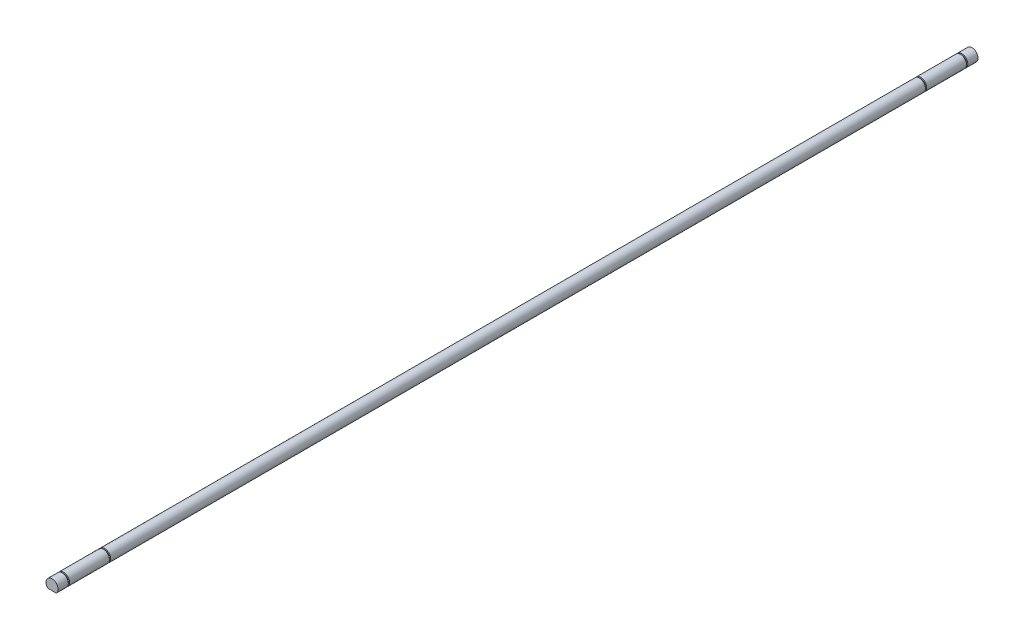
ISO-10303-21;
HEADER;
FILE_DESCRIPTION(('STEP AP214'),'2;1');
FILE_NAME('part.step','',(''),(''),'','','');
FILE_SCHEMA(('AUTOMOTIVE_DESIGN { 1 0 10303 214 1 1 1 1 }'));
ENDSEC;
DATA;
#1=APPLICATION_CONTEXT('core data for automotive mechanical design processes');
#2=APPLICATION_PROTOCOL_DEFINITION('international standard','automotive_design',2000,#1);
#3=PRODUCT_CONTEXT('',#1,'mechanical');
#4=PRODUCT('Part','Part','',(#3));
#5=PRODUCT_RELATED_PRODUCT_CATEGORY('part','',(#4));
#6=PRODUCT_DEFINITION_FORMATION('','',#4);
#7=PRODUCT_DEFINITION_CONTEXT('part definition',#1,'design');
#8=PRODUCT_DEFINITION('design','',#6,#7);
#9=PRODUCT_DEFINITION_SHAPE('','',#8);
#10=(LENGTH_UNIT() NAMED_UNIT(*) SI_UNIT(.MILLI.,.METRE.));
#11=(NAMED_UNIT(*) PLANE_ANGLE_UNIT() SI_UNIT($,.RADIAN.));
#12=(NAMED_UNIT(*) SI_UNIT($,.STERADIAN.) SOLID_ANGLE_UNIT());
#13=UNCERTAINTY_MEASURE_WITH_UNIT(LENGTH_MEASURE(1.E-05),#10,'distance_accuracy_value','');
#14=(GEOMETRIC_REPRESENTATION_CONTEXT(3) GLOBAL_UNCERTAINTY_ASSIGNED_CONTEXT((#13)) GLOBAL_UNIT_ASSIGNED_CONTEXT((#10,
#11,#12)) REPRESENTATION_CONTEXT('',''));
#15=CARTESIAN_POINT('',(0.,0.,0.));
#16=DIRECTION('',(0.,0.,1.));
#17=DIRECTION('',(1.,0.,0.));
#18=AXIS2_PLACEMENT_3D('',#15,#16,#17);
#19=CARTESIAN_POINT('',(482.6,57.15,-330.2));
#20=DIRECTION('',(0.,0.,1.));
#21=DIRECTION('',(1.,0.,0.));
#22=AXIS2_PLACEMENT_3D('',#19,#20,#21);
#23=CYLINDRICAL_SURFACE('',#22,2.36499999999997);
#24=DIRECTION('',(0.,0.,1.));
#25=VECTOR('',#24,1.);
#26=CARTESIAN_POINT('',(483.645574005032,55.0286796564403,-330.2));
#27=LINE('',#26,#25);
#28=CARTESIAN_POINT('',(483.645574005032,55.0286796564403,-325.12));
#29=VERTEX_POINT('',#28);
#30=CARTESIAN_POINT('',(483.645574005032,55.0286796564403,-324.485));
#31=VERTEX_POINT('',#30);
#32=EDGE_CURVE('E277',#29,#31,#27,.T.);
#33=ORIENTED_EDGE('',*,*,#32,.F.);
#34=CARTESIAN_POINT('',(482.6,57.15,-325.12));
#35=DIRECTION('',(0.,0.,1.));
#36=DIRECTION('',(1.,0.,0.));
#37=AXIS2_PLACEMENT_3D('',#34,#35,#36);
#38=CIRCLE('',#37,2.36499999999997);
#39=CARTESIAN_POINT('',(481.554425994967,55.0286796564404,-325.12));
#40=VERTEX_POINT('',#39);
#41=EDGE_CURVE('E251',#29,#40,#38,.T.);
#42=ORIENTED_EDGE('',*,*,#41,.T.);
#43=DIRECTION('',(0.,0.,1.));
#44=VECTOR('',#43,1.);
#45=CARTESIAN_POINT('',(481.554425994967,55.0286796564404,-330.2));
#46=LINE('',#45,#44);
#47=CARTESIAN_POINT('',(481.554425994967,55.0286796564404,-324.485));
#48=VERTEX_POINT('',#47);
#49=EDGE_CURVE('E280',#40,#48,#46,.T.);
#50=ORIENTED_EDGE('',*,*,#49,.T.);
#51=CARTESIAN_POINT('',(482.6,57.15,-324.485));
#52=DIRECTION('',(0.,0.,1.));
#53=DIRECTION('',(1.,0.,0.));
#54=AXIS2_PLACEMENT_3D('',#51,#52,#53);
#55=CIRCLE('',#54,2.36499999999997);
#56=EDGE_CURVE('E11',#31,#48,#55,.T.);
#57=ORIENTED_EDGE('',*,*,#56,.F.);
#58=EDGE_LOOP('',(#33,#42,#50,#57));
#59=FACE_BOUND('',#58,.T.);
#60=ADVANCED_FACE('F49',(#59),#23,.T.);
#61=CARTESIAN_POINT('',(4.50000598645352E-13,55.0286796564443,-101.6));
#62=DIRECTION('',(0.,1.,0.));
#63=DIRECTION('',(-1.,0.,0.));
#64=AXIS2_PLACEMENT_3D('',#61,#62,#63);
#65=PLANE('',#64);
#66=ORIENTED_EDGE('',*,*,#49,.F.);
#67=DIRECTION('',(1.,0.,0.));
#68=VECTOR('',#67,1.);
#69=CARTESIAN_POINT('',(4.50000598645352E-13,55.0286796564443,-325.12));
#70=LINE('',#69,#68);
#71=CARTESIAN_POINT('',(480.47867965644,55.0286796564404,-325.12));
#72=VERTEX_POINT('',#71);
#73=EDGE_CURVE('E64',#72,#40,#70,.T.);
#74=ORIENTED_EDGE('',*,*,#73,.F.);
#75=DIRECTION('',(0.,0.,1.));
#76=VECTOR('',#75,1.);
#77=CARTESIAN_POINT('',(480.47867965644,55.0286796564404,-330.2));
#78=LINE('',#77,#76);
#79=CARTESIAN_POINT('',(480.47867965644,55.0286796564404,-330.2));
#80=VERTEX_POINT('',#79);
#81=EDGE_CURVE('E249',#80,#72,#78,.T.);
#82=ORIENTED_EDGE('',*,*,#81,.F.);
#83=DIRECTION('',(-1.,0.,0.));
#84=VECTOR('',#83,1.);
#85=CARTESIAN_POINT('',(4.50000598645352E-13,55.0286796564443,-330.2));
#86=LINE('',#85,#84);
#87=CARTESIAN_POINT('',(484.72132034356,55.0286796564403,-330.2));
#88=VERTEX_POINT('',#87);
#89=EDGE_CURVE('E272',#88,#80,#86,.T.);
#90=ORIENTED_EDGE('',*,*,#89,.F.);
#91=DIRECTION('',(0.,0.,1.));
#92=VECTOR('',#91,1.);
#93=CARTESIAN_POINT('',(484.72132034356,55.0286796564403,-330.2));
#94=LINE('',#93,#92);
#95=CARTESIAN_POINT('',(484.72132034356,55.0286796564403,-325.12));
#96=VERTEX_POINT('',#95);
#97=EDGE_CURVE('E245',#88,#96,#94,.T.);
#98=ORIENTED_EDGE('',*,*,#97,.T.);
#99=EDGE_CURVE('E241',#29,#96,#70,.T.);
#100=ORIENTED_EDGE('',*,*,#99,.F.);
#101=ORIENTED_EDGE('',*,*,#32,.T.);
#102=DIRECTION('',(1.,0.,0.));
#103=VECTOR('',#102,1.);
#104=CARTESIAN_POINT('',(4.50000598645352E-13,55.0286796564443,-324.485));
#105=LINE('',#104,#103);
#106=CARTESIAN_POINT('',(484.72132034356,55.0286796564403,-324.485));
#107=VERTEX_POINT('',#106);
#108=EDGE_CURVE('E260',#31,#107,#105,.T.);
#109=ORIENTED_EDGE('',*,*,#108,.T.);
#110=DIRECTION('',(0.,0.,1.));
#111=VECTOR('',#110,1.);
#112=CARTESIAN_POINT('',(484.72132034356,55.0286796564403,-324.485));
#113=LINE('',#112,#111);
#114=CARTESIAN_POINT('',(484.72132034356,55.0286796564403,-304.699971157455));
#115=VERTEX_POINT('',#114);
#116=EDGE_CURVE('E263',#107,#115,#113,.T.);
#117=ORIENTED_EDGE('',*,*,#116,.T.);
#118=DIRECTION('',(1.,0.,0.));
#119=VECTOR('',#118,1.);
#120=CARTESIAN_POINT('',(4.50000598645352E-13,55.0286796564443,-304.699971157455));
#121=LINE('',#120,#119);
#122=CARTESIAN_POINT('',(483.645574005032,55.0286796564403,-304.699971157455));
#123=VERTEX_POINT('',#122);
#124=EDGE_CURVE('E255',#123,#115,#121,.T.);
#125=ORIENTED_EDGE('',*,*,#124,.F.);
#126=CARTESIAN_POINT('',(483.645574005032,55.0286796564403,-304.064971157455));
#127=VERTEX_POINT('',#126);
#128=EDGE_CURVE('E274',#123,#127,#27,.T.);
#129=ORIENTED_EDGE('',*,*,#128,.T.);
#130=DIRECTION('',(1.,0.,0.));
#131=VECTOR('',#130,1.);
#132=CARTESIAN_POINT('',(4.50000598645352E-13,55.0286796564443,-304.064971157455));
#133=LINE('',#132,#131);
#134=CARTESIAN_POINT('',(484.72132034356,55.0286796564403,-304.064971157455));
#135=VERTEX_POINT('',#134);
#136=EDGE_CURVE('E282',#127,#135,#133,.T.);
#137=ORIENTED_EDGE('',*,*,#136,.T.);
#138=DIRECTION('',(0.,0.,-1.));
#139=VECTOR('',#138,1.);
#140=CARTESIAN_POINT('',(484.72132034356,55.0286796564403,-101.6));
#141=LINE('',#140,#139);
#142=CARTESIAN_POINT('',(484.72132034356,55.0286796564403,100.864971157455));
#143=VERTEX_POINT('',#142);
#144=EDGE_CURVE('E291',#143,#135,#141,.T.);
#145=ORIENTED_EDGE('',*,*,#144,.F.);
#146=DIRECTION('',(1.,0.,0.));
#147=VECTOR('',#146,1.);
#148=CARTESIAN_POINT('',(4.50000598645352E-13,55.0286796564443,100.864971157455));
#149=LINE('',#148,#147);
#150=CARTESIAN_POINT('',(483.645574005032,55.0286796564403,100.864971157455));
#151=VERTEX_POINT('',#150);
#152=EDGE_CURVE('E229',#151,#143,#149,.T.);
#153=ORIENTED_EDGE('',*,*,#152,.F.);
#154=DIRECTION('',(0.,0.,-1.));
#155=VECTOR('',#154,1.);
#156=CARTESIAN_POINT('',(483.645574005032,55.0286796564403,127.));
#157=LINE('',#156,#155);
#158=CARTESIAN_POINT('',(483.645574005032,55.0286796564403,101.499971157456));
#159=VERTEX_POINT('',#158);
#160=EDGE_CURVE('E191',#159,#151,#157,.T.);
#161=ORIENTED_EDGE('',*,*,#160,.F.);
#162=DIRECTION('',(1.,0.,0.));
#163=VECTOR('',#162,1.);
#164=CARTESIAN_POINT('',(4.50000598645352E-13,55.0286796564443,101.499971157456));
#165=LINE('',#164,#163);
#166=CARTESIAN_POINT('',(484.72132034356,55.0286796564403,101.499971157456));
#167=VERTEX_POINT('',#166);
#168=EDGE_CURVE('E204',#159,#167,#165,.T.);
#169=ORIENTED_EDGE('',*,*,#168,.T.);
#170=DIRECTION('',(0.,0.,-1.));
#171=VECTOR('',#170,1.);
#172=CARTESIAN_POINT('',(484.72132034356,55.0286796564403,121.285));
#173=LINE('',#172,#171);
#174=CARTESIAN_POINT('',(484.72132034356,55.0286796564403,121.285));
#175=VERTEX_POINT('',#174);
#176=EDGE_CURVE('E210',#175,#167,#173,.T.);
#177=ORIENTED_EDGE('',*,*,#176,.F.);
#178=DIRECTION('',(1.,0.,0.));
#179=VECTOR('',#178,1.);
#180=CARTESIAN_POINT('',(4.50000598645352E-13,55.0286796564443,121.285));
#181=LINE('',#180,#179);
#182=CARTESIAN_POINT('',(483.645574005032,55.0286796564403,121.285));
#183=VERTEX_POINT('',#182);
#184=EDGE_CURVE('E208',#183,#175,#181,.T.);
#185=ORIENTED_EDGE('',*,*,#184,.F.);
#186=CARTESIAN_POINT('',(483.645574005032,55.0286796564403,121.92));
#187=VERTEX_POINT('',#186);
#188=EDGE_CURVE('E222',#187,#183,#157,.T.);
#189=ORIENTED_EDGE('',*,*,#188,.F.);
#190=DIRECTION('',(1.,0.,0.));
#191=VECTOR('',#190,1.);
#192=CARTESIAN_POINT('',(4.50000598645352E-13,55.0286796564443,121.92));
#193=LINE('',#192,#191);
#194=CARTESIAN_POINT('',(484.72132034356,55.0286796564403,121.92));
#195=VERTEX_POINT('',#194);
#196=EDGE_CURVE('E196',#187,#195,#193,.T.);
#197=ORIENTED_EDGE('',*,*,#196,.T.);
#198=DIRECTION('',(0.,0.,-1.));
#199=VECTOR('',#198,1.);
#200=CARTESIAN_POINT('',(484.72132034356,55.0286796564403,127.));
#201=LINE('',#200,#199);
#202=CARTESIAN_POINT('',(484.72132034356,55.0286796564403,127.));
#203=VERTEX_POINT('',#202);
#204=EDGE_CURVE('E180',#203,#195,#201,.T.);
#205=ORIENTED_EDGE('',*,*,#204,.F.);
#206=DIRECTION('',(-1.,0.,0.));
#207=VECTOR('',#206,1.);
#208=CARTESIAN_POINT('',(4.50000598645352E-13,55.0286796564443,127.));
#209=LINE('',#208,#207);
#210=CARTESIAN_POINT('',(480.47867965644,55.0286796564404,127.));
#211=VERTEX_POINT('',#210);
#212=EDGE_CURVE('E188',#203,#211,#209,.T.);
#213=ORIENTED_EDGE('',*,*,#212,.T.);
#214=DIRECTION('',(0.,0.,-1.));
#215=VECTOR('',#214,1.);
#216=CARTESIAN_POINT('',(480.47867965644,55.0286796564404,127.));
#217=LINE('',#216,#215);
#218=CARTESIAN_POINT('',(480.47867965644,55.0286796564404,121.92));
#219=VERTEX_POINT('',#218);
#220=EDGE_CURVE('E183',#211,#219,#217,.T.);
#221=ORIENTED_EDGE('',*,*,#220,.T.);
#222=CARTESIAN_POINT('',(481.554425994967,55.0286796564404,121.92));
#223=VERTEX_POINT('',#222);
#224=EDGE_CURVE('E380',#219,#223,#193,.T.);
#225=ORIENTED_EDGE('',*,*,#224,.T.);
#226=DIRECTION('',(0.,0.,-1.));
#227=VECTOR('',#226,1.);
#228=CARTESIAN_POINT('',(481.554425994967,55.0286796564404,127.));
#229=LINE('',#228,#227);
#230=CARTESIAN_POINT('',(481.554425994967,55.0286796564404,121.285));
#231=VERTEX_POINT('',#230);
#232=EDGE_CURVE('E226',#223,#231,#229,.T.);
#233=ORIENTED_EDGE('',*,*,#232,.T.);
#234=CARTESIAN_POINT('',(480.47867965644,55.0286796564404,121.285));
#235=VERTEX_POINT('',#234);
#236=EDGE_CURVE('E205',#235,#231,#181,.T.);
#237=ORIENTED_EDGE('',*,*,#236,.F.);
#238=DIRECTION('',(0.,0.,-1.));
#239=VECTOR('',#238,1.);
#240=CARTESIAN_POINT('',(480.47867965644,55.0286796564404,121.285));
#241=LINE('',#240,#239);
#242=CARTESIAN_POINT('',(480.47867965644,55.0286796564404,101.499971157456));
#243=VERTEX_POINT('',#242);
#244=EDGE_CURVE('E216',#235,#243,#241,.T.);
#245=ORIENTED_EDGE('',*,*,#244,.T.);
#246=CARTESIAN_POINT('',(481.554425994967,55.0286796564404,101.499971157456));
#247=VERTEX_POINT('',#246);
#248=EDGE_CURVE('E211',#243,#247,#165,.T.);
#249=ORIENTED_EDGE('',*,*,#248,.T.);
#250=CARTESIAN_POINT('',(481.554425994967,55.0286796564404,100.864971157455));
#251=VERTEX_POINT('',#250);
#252=EDGE_CURVE('E225',#247,#251,#229,.T.);
#253=ORIENTED_EDGE('',*,*,#252,.T.);
#254=CARTESIAN_POINT('',(480.47867965644,55.0286796564404,100.864971157455));
#255=VERTEX_POINT('',#254);
#256=EDGE_CURVE('E230',#255,#251,#149,.T.);
#257=ORIENTED_EDGE('',*,*,#256,.F.);
#258=DIRECTION('',(0.,0.,-1.));
#259=VECTOR('',#258,1.);
#260=CARTESIAN_POINT('',(480.47867965644,55.0286796564404,-101.6));
#261=LINE('',#260,#259);
#262=CARTESIAN_POINT('',(480.47867965644,55.0286796564404,-304.064971157455));
#263=VERTEX_POINT('',#262);
#264=EDGE_CURVE('E288',#255,#263,#261,.T.);
#265=ORIENTED_EDGE('',*,*,#264,.T.);
#266=CARTESIAN_POINT('',(481.554425994967,55.0286796564404,-304.064971157455));
#267=VERTEX_POINT('',#266);
#268=EDGE_CURVE('E283',#263,#267,#133,.T.);
#269=ORIENTED_EDGE('',*,*,#268,.T.);
#270=CARTESIAN_POINT('',(481.554425994967,55.0286796564404,-304.699971157455));
#271=VERTEX_POINT('',#270);
#272=EDGE_CURVE('E279',#271,#267,#46,.T.);
#273=ORIENTED_EDGE('',*,*,#272,.F.);
#274=CARTESIAN_POINT('',(480.47867965644,55.0286796564404,-304.699971157455));
#275=VERTEX_POINT('',#274);
#276=EDGE_CURVE('E72',#275,#271,#121,.T.);
#277=ORIENTED_EDGE('',*,*,#276,.F.);
#278=DIRECTION('',(0.,0.,1.));
#279=VECTOR('',#278,1.);
#280=CARTESIAN_POINT('',(480.47867965644,55.0286796564404,-324.485));
#281=LINE('',#280,#279);
#282=CARTESIAN_POINT('',(480.47867965644,55.0286796564404,-324.485));
#283=VERTEX_POINT('',#282);
#284=EDGE_CURVE('E267',#283,#275,#281,.T.);
#285=ORIENTED_EDGE('',*,*,#284,.F.);
#286=EDGE_CURVE('E256',#283,#48,#105,.T.);
#287=ORIENTED_EDGE('',*,*,#286,.T.);
#288=EDGE_LOOP('',(#66,#74,#82,#90,#98,#100,#101,#109,#117,#125,#129,#137,#145,#153,#161,#169,
#177,#185,#189,#197,#205,#213,#221,#225,#233,#237,#245,#249,#253,#257,#265,#269,#273,#277,#285,#287));
#289=FACE_BOUND('',#288,.T.);
#290=ADVANCED_FACE('F51',(#289),#65,.F.);
#291=CARTESIAN_POINT('',(482.6,57.15,-101.6));
#292=DIRECTION('',(0.,0.,-1.));
#293=DIRECTION('',(-1.,0.,0.));
#294=AXIS2_PLACEMENT_3D('',#291,#292,#293);
#295=CYLINDRICAL_SURFACE('',#294,2.99999999999999);
#296=CARTESIAN_POINT('',(482.6,57.15,-304.064971157455));
#297=DIRECTION('',(0.,0.,1.));
#298=DIRECTION('',(1.,0.,0.));
#299=AXIS2_PLACEMENT_3D('',#296,#297,#298);
#300=CIRCLE('',#299,2.99999999999999);
#301=EDGE_CURVE('E286',#135,#263,#300,.T.);
#302=ORIENTED_EDGE('',*,*,#301,.T.);
#303=ORIENTED_EDGE('',*,*,#264,.F.);
#304=CARTESIAN_POINT('',(482.6,57.15,100.864971157455));
#305=DIRECTION('',(0.,0.,1.));
#306=DIRECTION('',(1.,0.,0.));
#307=AXIS2_PLACEMENT_3D('',#304,#305,#306);
#308=CIRCLE('',#307,2.99999999999999);
#309=EDGE_CURVE('E233',#143,#255,#308,.T.);
#310=ORIENTED_EDGE('',*,*,#309,.F.);
#311=ORIENTED_EDGE('',*,*,#144,.T.);
#312=EDGE_LOOP('',(#302,#303,#310,#311));
#313=FACE_BOUND('',#312,.T.);
#314=ADVANCED_FACE('F345',(#313),#295,.T.);
#315=CARTESIAN_POINT('',(0.,0.,-304.064971157455));
#316=DIRECTION('',(0.,0.,1.));
#317=DIRECTION('',(1.,0.,0.));
#318=AXIS2_PLACEMENT_3D('',#315,#316,#317);
#319=PLANE('',#318);
#320=CARTESIAN_POINT('',(482.6,57.15,-304.064971157455));
#321=DIRECTION('',(0.,0.,-1.));
#322=DIRECTION('',(-1.,0.,0.));
#323=AXIS2_PLACEMENT_3D('',#320,#321,#322);
#324=CIRCLE('',#323,2.36499999999997);
#325=EDGE_CURVE('E269',#267,#127,#324,.T.);
#326=ORIENTED_EDGE('',*,*,#325,.F.);
#327=ORIENTED_EDGE('',*,*,#268,.F.);
#328=ORIENTED_EDGE('',*,*,#301,.F.);
#329=ORIENTED_EDGE('',*,*,#136,.F.);
#330=EDGE_LOOP('',(#326,#327,#328,#329));
#331=FACE_BOUND('',#330,.T.);
#332=ADVANCED_FACE('F303',(#331),#319,.F.);
#333=ORIENTED_EDGE('',*,*,#128,.F.);
#334=CARTESIAN_POINT('',(482.6,57.15,-304.699971157455));
#335=DIRECTION('',(0.,0.,1.));
#336=DIRECTION('',(1.,0.,0.));
#337=AXIS2_PLACEMENT_3D('',#334,#335,#336);
#338=CIRCLE('',#337,2.36499999999997);
#339=EDGE_CURVE('E57',#123,#271,#338,.T.);
#340=ORIENTED_EDGE('',*,*,#339,.T.);
#341=ORIENTED_EDGE('',*,*,#272,.T.);
#342=ORIENTED_EDGE('',*,*,#325,.T.);
#343=EDGE_LOOP('',(#333,#340,#341,#342));
#344=FACE_BOUND('',#343,.T.);
#345=ADVANCED_FACE('F296',(#344),#23,.T.);
#346=CARTESIAN_POINT('',(0.,0.,-330.2));
#347=DIRECTION('',(0.,0.,-1.));
#348=DIRECTION('',(-1.,0.,0.));
#349=AXIS2_PLACEMENT_3D('',#346,#347,#348);
#350=PLANE('',#349);
#351=ORIENTED_EDGE('',*,*,#89,.T.);
#352=CARTESIAN_POINT('',(482.6,57.15,-330.2));
#353=DIRECTION('',(0.,0.,1.));
#354=DIRECTION('',(1.,0.,0.));
#355=AXIS2_PLACEMENT_3D('',#352,#353,#354);
#356=CIRCLE('',#355,2.99999999999999);
#357=EDGE_CURVE('E242',#88,#80,#356,.T.);
#358=ORIENTED_EDGE('',*,*,#357,.F.);
#359=EDGE_LOOP('',(#351,#358));
#360=FACE_BOUND('',#359,.T.);
#361=ADVANCED_FACE('F329',(#360),#350,.T.);
#362=CARTESIAN_POINT('',(482.6,57.15,-324.485));
#363=DIRECTION('',(0.,0.,1.));
#364=DIRECTION('',(1.,0.,0.));
#365=AXIS2_PLACEMENT_3D('',#362,#363,#364);
#366=CYLINDRICAL_SURFACE('',#365,2.99999999999999);
#367=CARTESIAN_POINT('',(482.6,57.15,-304.699971157455));
#368=DIRECTION('',(0.,0.,1.));
#369=DIRECTION('',(1.,0.,0.));
#370=AXIS2_PLACEMENT_3D('',#367,#368,#369);
#371=CIRCLE('',#370,2.99999999999999);
#372=EDGE_CURVE('E265',#115,#275,#371,.T.);
#373=ORIENTED_EDGE('',*,*,#372,.F.);
#374=ORIENTED_EDGE('',*,*,#116,.F.);
#375=CARTESIAN_POINT('',(482.6,57.15,-324.485));
#376=DIRECTION('',(0.,0.,1.));
#377=DIRECTION('',(1.,0.,0.));
#378=AXIS2_PLACEMENT_3D('',#375,#376,#377);
#379=CIRCLE('',#378,2.99999999999999);
#380=EDGE_CURVE('E259',#107,#283,#379,.T.);
#381=ORIENTED_EDGE('',*,*,#380,.T.);
#382=ORIENTED_EDGE('',*,*,#284,.T.);
#383=EDGE_LOOP('',(#373,#374,#381,#382));
#384=FACE_BOUND('',#383,.T.);
#385=ADVANCED_FACE('F311',(#384),#366,.T.);
#386=CARTESIAN_POINT('',(0.,0.,-324.485));
#387=DIRECTION('',(0.,0.,1.));
#388=DIRECTION('',(1.,0.,0.));
#389=AXIS2_PLACEMENT_3D('',#386,#387,#388);
#390=PLANE('',#389);
#391=ORIENTED_EDGE('',*,*,#108,.F.);
#392=ORIENTED_EDGE('',*,*,#56,.T.);
#393=ORIENTED_EDGE('',*,*,#286,.F.);
#394=ORIENTED_EDGE('',*,*,#380,.F.);
#395=EDGE_LOOP('',(#391,#392,#393,#394));
#396=FACE_BOUND('',#395,.T.);
#397=ADVANCED_FACE('F316',(#396),#390,.F.);
#398=CARTESIAN_POINT('',(0.,0.,-304.699971157455));
#399=DIRECTION('',(0.,0.,1.));
#400=DIRECTION('',(1.,0.,0.));
#401=AXIS2_PLACEMENT_3D('',#398,#399,#400);
#402=PLANE('',#401);
#403=ORIENTED_EDGE('',*,*,#339,.F.);
#404=ORIENTED_EDGE('',*,*,#124,.T.);
#405=ORIENTED_EDGE('',*,*,#372,.T.);
#406=ORIENTED_EDGE('',*,*,#276,.T.);
#407=EDGE_LOOP('',(#403,#404,#405,#406));
#408=FACE_BOUND('',#407,.T.);
#409=ADVANCED_FACE('F309',(#408),#402,.T.);
#410=CARTESIAN_POINT('',(0.,0.,-325.12));
#411=DIRECTION('',(0.,0.,1.));
#412=DIRECTION('',(1.,0.,0.));
#413=AXIS2_PLACEMENT_3D('',#410,#411,#412);
#414=PLANE('',#413);
#415=ORIENTED_EDGE('',*,*,#41,.F.);
#416=ORIENTED_EDGE('',*,*,#99,.T.);
#417=CARTESIAN_POINT('',(482.6,57.15,-325.12));
#418=DIRECTION('',(0.,0.,1.));
#419=DIRECTION('',(1.,0.,0.));
#420=AXIS2_PLACEMENT_3D('',#417,#418,#419);
#421=CIRCLE('',#420,2.99999999999999);
#422=EDGE_CURVE('E246',#96,#72,#421,.T.);
#423=ORIENTED_EDGE('',*,*,#422,.T.);
#424=ORIENTED_EDGE('',*,*,#73,.T.);
#425=EDGE_LOOP('',(#415,#416,#423,#424));
#426=FACE_BOUND('',#425,.T.);
#427=ADVANCED_FACE('F322',(#426),#414,.T.);
#428=CARTESIAN_POINT('',(482.6,57.15,-330.2));
#429=DIRECTION('',(0.,0.,1.));
#430=DIRECTION('',(1.,0.,0.));
#431=AXIS2_PLACEMENT_3D('',#428,#429,#430);
#432=CYLINDRICAL_SURFACE('',#431,2.99999999999999);
#433=ORIENTED_EDGE('',*,*,#422,.F.);
#434=ORIENTED_EDGE('',*,*,#97,.F.);
#435=ORIENTED_EDGE('',*,*,#357,.T.);
#436=ORIENTED_EDGE('',*,*,#81,.T.);
#437=EDGE_LOOP('',(#433,#434,#435,#436));
#438=FACE_BOUND('',#437,.T.);
#439=ADVANCED_FACE('F326',(#438),#432,.T.);
#440=CARTESIAN_POINT('',(482.6,57.15,127.));
#441=DIRECTION('',(0.,0.,-1.));
#442=DIRECTION('',(1.,0.,0.));
#443=AXIS2_PLACEMENT_3D('',#440,#441,#442);
#444=CYLINDRICAL_SURFACE('',#443,2.36499999999997);
#445=ORIENTED_EDGE('',*,*,#188,.T.);
#446=CARTESIAN_POINT('',(482.6,57.15,121.285));
#447=DIRECTION('',(0.,0.,1.));
#448=DIRECTION('',(1.,0.,0.));
#449=AXIS2_PLACEMENT_3D('',#446,#447,#448);
#450=CIRCLE('',#449,2.36499999999997);
#451=EDGE_CURVE('E238',#183,#231,#450,.T.);
#452=ORIENTED_EDGE('',*,*,#451,.T.);
#453=ORIENTED_EDGE('',*,*,#232,.F.);
#454=CARTESIAN_POINT('',(482.6,57.15,121.92));
#455=DIRECTION('',(0.,0.,1.));
#456=DIRECTION('',(1.,0.,0.));
#457=AXIS2_PLACEMENT_3D('',#454,#455,#456);
#458=CIRCLE('',#457,2.36499999999997);
#459=EDGE_CURVE('E198',#187,#223,#458,.T.);
#460=ORIENTED_EDGE('',*,*,#459,.F.);
#461=EDGE_LOOP('',(#445,#452,#453,#460));
#462=FACE_BOUND('',#461,.T.);
#463=ADVANCED_FACE('F376',(#462),#444,.T.);
#464=CARTESIAN_POINT('',(0.,0.,100.864971157455));
#465=DIRECTION('',(0.,0.,-1.));
#466=DIRECTION('',(1.,0.,0.));
#467=AXIS2_PLACEMENT_3D('',#464,#465,#466);
#468=PLANE('',#467);
#469=CARTESIAN_POINT('',(482.6,57.15,100.864971157455));
#470=DIRECTION('',(0.,0.,-1.));
#471=DIRECTION('',(-1.,0.,0.));
#472=AXIS2_PLACEMENT_3D('',#469,#470,#471);
#473=CIRCLE('',#472,2.36499999999997);
#474=EDGE_CURVE('E192',#251,#151,#473,.T.);
#475=ORIENTED_EDGE('',*,*,#474,.T.);
#476=ORIENTED_EDGE('',*,*,#152,.T.);
#477=ORIENTED_EDGE('',*,*,#309,.T.);
#478=ORIENTED_EDGE('',*,*,#256,.T.);
#479=EDGE_LOOP('',(#475,#476,#477,#478));
#480=FACE_BOUND('',#479,.T.);
#481=ADVANCED_FACE('F352',(#480),#468,.F.);
#482=ORIENTED_EDGE('',*,*,#160,.T.);
#483=ORIENTED_EDGE('',*,*,#474,.F.);
#484=ORIENTED_EDGE('',*,*,#252,.F.);
#485=CARTESIAN_POINT('',(482.6,57.15,101.499971157456));
#486=DIRECTION('',(0.,0.,1.));
#487=DIRECTION('',(1.,0.,0.));
#488=AXIS2_PLACEMENT_3D('',#485,#486,#487);
#489=CIRCLE('',#488,2.36499999999997);
#490=EDGE_CURVE('E236',#159,#247,#489,.T.);
#491=ORIENTED_EDGE('',*,*,#490,.F.);
#492=EDGE_LOOP('',(#482,#483,#484,#491));
#493=FACE_BOUND('',#492,.T.);
#494=ADVANCED_FACE('F359',(#493),#444,.T.);
#495=CARTESIAN_POINT('',(0.,0.,127.));
#496=DIRECTION('',(0.,0.,1.));
#497=DIRECTION('',(-1.,0.,0.));
#498=AXIS2_PLACEMENT_3D('',#495,#496,#497);
#499=PLANE('',#498);
#500=ORIENTED_EDGE('',*,*,#212,.F.);
#501=CARTESIAN_POINT('',(482.6,57.15,127.));
#502=DIRECTION('',(0.,0.,1.));
#503=DIRECTION('',(1.,0.,0.));
#504=AXIS2_PLACEMENT_3D('',#501,#502,#503);
#505=CIRCLE('',#504,2.99999999999999);
#506=EDGE_CURVE('E176',#203,#211,#505,.T.);
#507=ORIENTED_EDGE('',*,*,#506,.T.);
#508=EDGE_LOOP('',(#500,#507));
#509=FACE_BOUND('',#508,.T.);
#510=ADVANCED_FACE('F189',(#509),#499,.T.);
#511=CARTESIAN_POINT('',(482.6,57.15,121.285));
#512=DIRECTION('',(0.,0.,-1.));
#513=DIRECTION('',(1.,0.,0.));
#514=AXIS2_PLACEMENT_3D('',#511,#512,#513);
#515=CYLINDRICAL_SURFACE('',#514,2.99999999999999);
#516=CARTESIAN_POINT('',(482.6,57.15,101.499971157456));
#517=DIRECTION('',(0.,0.,1.));
#518=DIRECTION('',(1.,0.,0.));
#519=AXIS2_PLACEMENT_3D('',#516,#517,#518);
#520=CIRCLE('',#519,2.99999999999999);
#521=EDGE_CURVE('E214',#167,#243,#520,.T.);
#522=ORIENTED_EDGE('',*,*,#521,.T.);
#523=ORIENTED_EDGE('',*,*,#244,.F.);
#524=CARTESIAN_POINT('',(482.6,57.15,121.285));
#525=DIRECTION('',(0.,0.,1.));
#526=DIRECTION('',(1.,0.,0.));
#527=AXIS2_PLACEMENT_3D('',#524,#525,#526);
#528=CIRCLE('',#527,2.99999999999999);
#529=EDGE_CURVE('E207',#175,#235,#528,.T.);
#530=ORIENTED_EDGE('',*,*,#529,.F.);
#531=ORIENTED_EDGE('',*,*,#176,.T.);
#532=EDGE_LOOP('',(#522,#523,#530,#531));
#533=FACE_BOUND('',#532,.T.);
#534=ADVANCED_FACE('F367',(#533),#515,.T.);
#535=CARTESIAN_POINT('',(0.,0.,121.285));
#536=DIRECTION('',(0.,0.,-1.));
#537=DIRECTION('',(1.,0.,0.));
#538=AXIS2_PLACEMENT_3D('',#535,#536,#537);
#539=PLANE('',#538);
#540=ORIENTED_EDGE('',*,*,#184,.T.);
#541=ORIENTED_EDGE('',*,*,#529,.T.);
#542=ORIENTED_EDGE('',*,*,#236,.T.);
#543=ORIENTED_EDGE('',*,*,#451,.F.);
#544=EDGE_LOOP('',(#540,#541,#542,#543));
#545=FACE_BOUND('',#544,.T.);
#546=ADVANCED_FACE('F371',(#545),#539,.F.);
#547=CARTESIAN_POINT('',(0.,0.,101.499971157456));
#548=DIRECTION('',(0.,0.,-1.));
#549=DIRECTION('',(1.,0.,0.));
#550=AXIS2_PLACEMENT_3D('',#547,#548,#549);
#551=PLANE('',#550);
#552=ORIENTED_EDGE('',*,*,#490,.T.);
#553=ORIENTED_EDGE('',*,*,#248,.F.);
#554=ORIENTED_EDGE('',*,*,#521,.F.);
#555=ORIENTED_EDGE('',*,*,#168,.F.);
#556=EDGE_LOOP('',(#552,#553,#554,#555));
#557=FACE_BOUND('',#556,.T.);
#558=ADVANCED_FACE('F364',(#557),#551,.T.);
#559=CARTESIAN_POINT('',(0.,0.,121.92));
#560=DIRECTION('',(0.,0.,-1.));
#561=DIRECTION('',(1.,0.,0.));
#562=AXIS2_PLACEMENT_3D('',#559,#560,#561);
#563=PLANE('',#562);
#564=ORIENTED_EDGE('',*,*,#459,.T.);
#565=ORIENTED_EDGE('',*,*,#224,.F.);
#566=CARTESIAN_POINT('',(482.6,57.15,121.92));
#567=DIRECTION('',(0.,0.,1.));
#568=DIRECTION('',(1.,0.,0.));
#569=AXIS2_PLACEMENT_3D('',#566,#567,#568);
#570=CIRCLE('',#569,2.99999999999999);
#571=EDGE_CURVE('E186',#195,#219,#570,.T.);
#572=ORIENTED_EDGE('',*,*,#571,.F.);
#573=ORIENTED_EDGE('',*,*,#196,.F.);
#574=EDGE_LOOP('',(#564,#565,#572,#573));
#575=FACE_BOUND('',#574,.T.);
#576=ADVANCED_FACE('F379',(#575),#563,.T.);
#577=CARTESIAN_POINT('',(482.6,57.15,127.));
#578=DIRECTION('',(0.,0.,-1.));
#579=DIRECTION('',(1.,0.,0.));
#580=AXIS2_PLACEMENT_3D('',#577,#578,#579);
#581=CYLINDRICAL_SURFACE('',#580,2.99999999999999);
#582=ORIENTED_EDGE('',*,*,#571,.T.);
#583=ORIENTED_EDGE('',*,*,#220,.F.);
#584=ORIENTED_EDGE('',*,*,#506,.F.);
#585=ORIENTED_EDGE('',*,*,#204,.T.);
#586=EDGE_LOOP('',(#582,#583,#584,#585));
#587=FACE_BOUND('',#586,.T.);
#588=ADVANCED_FACE('F178',(#587),#581,.T.);
#589=CLOSED_SHELL('',(#60,#290,#314,#332,#345,#361,#385,#397,#409,#427,#439,#463,#481,#494,#510,
#534,#546,#558,#576,#588));
#590=MANIFOLD_SOLID_BREP('B2',#589);
#591=ADVANCED_BREP_SHAPE_REPRESENTATION('',(#18,#590),#14);
#592=SHAPE_DEFINITION_REPRESENTATION(#9,#591);
ENDSEC;
END-ISO-10303-21;
